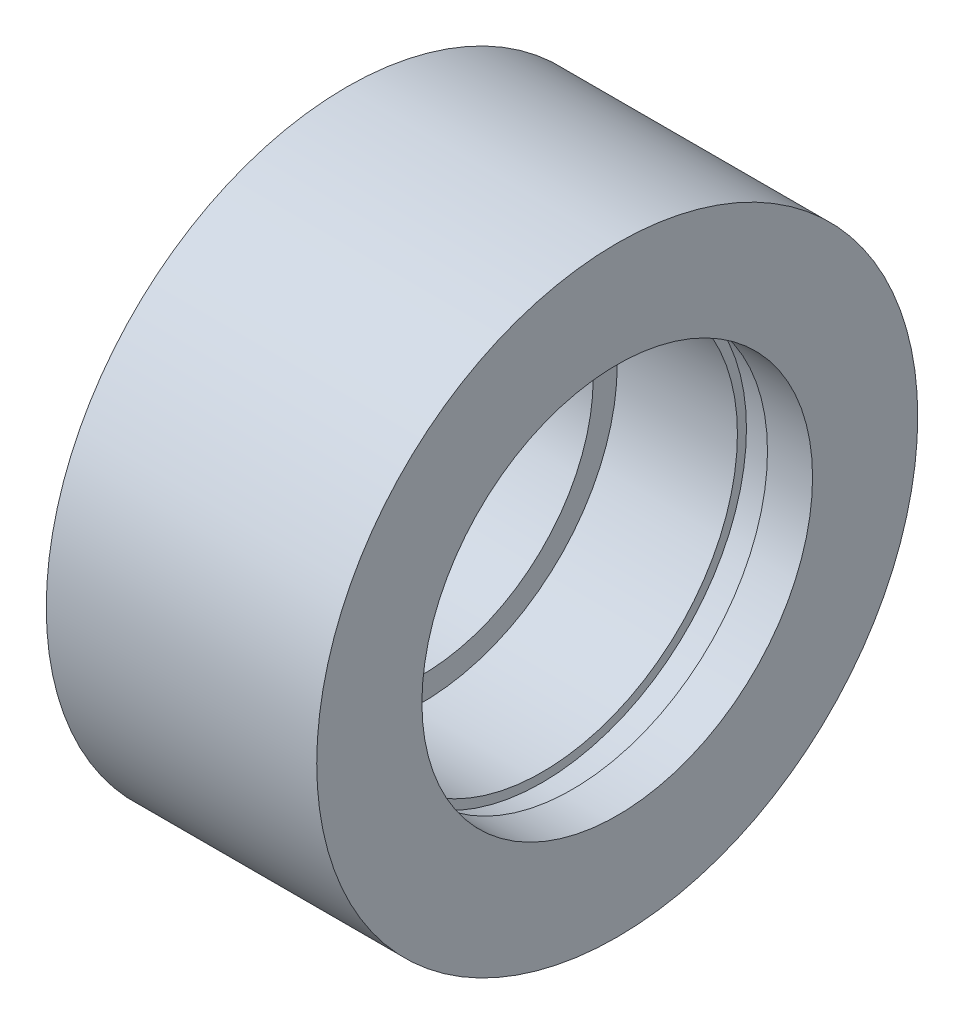
ISO-10303-21;
HEADER;
FILE_DESCRIPTION(('STEP AP214'),'2;1');
FILE_NAME('part.step','',(''),(''),'','','');
FILE_SCHEMA(('AUTOMOTIVE_DESIGN { 1 0 10303 214 1 1 1 1 }'));
ENDSEC;
DATA;
#1=APPLICATION_CONTEXT('core data for automotive mechanical design processes');
#2=APPLICATION_PROTOCOL_DEFINITION('international standard','automotive_design',2000,#1);
#3=PRODUCT_CONTEXT('',#1,'mechanical');
#4=PRODUCT('Part','Part','',(#3));
#5=PRODUCT_RELATED_PRODUCT_CATEGORY('part','',(#4));
#6=PRODUCT_DEFINITION_FORMATION('','',#4);
#7=PRODUCT_DEFINITION_CONTEXT('part definition',#1,'design');
#8=PRODUCT_DEFINITION('design','',#6,#7);
#9=PRODUCT_DEFINITION_SHAPE('','',#8);
#10=(LENGTH_UNIT() NAMED_UNIT(*) SI_UNIT(.MILLI.,.METRE.));
#11=(NAMED_UNIT(*) PLANE_ANGLE_UNIT() SI_UNIT($,.RADIAN.));
#12=(NAMED_UNIT(*) SI_UNIT($,.STERADIAN.) SOLID_ANGLE_UNIT());
#13=UNCERTAINTY_MEASURE_WITH_UNIT(LENGTH_MEASURE(1.E-05),#10,'distance_accuracy_value','');
#14=(GEOMETRIC_REPRESENTATION_CONTEXT(3) GLOBAL_UNCERTAINTY_ASSIGNED_CONTEXT((#13)) GLOBAL_UNIT_ASSIGNED_CONTEXT((#10,
#11,#12)) REPRESENTATION_CONTEXT('',''));
#15=CARTESIAN_POINT('',(0.,0.,0.));
#16=DIRECTION('',(0.,0.,1.));
#17=DIRECTION('',(1.,0.,0.));
#18=AXIS2_PLACEMENT_3D('',#15,#16,#17);
#19=CARTESIAN_POINT('',(-4.5,-10.2732395765881,10.));
#20=DIRECTION('',(-1.,0.,0.));
#21=DIRECTION('',(0.,1.,0.));
#22=AXIS2_PLACEMENT_3D('',#19,#20,#21);
#23=PLANE('',#22);
#24=CARTESIAN_POINT('',(-4.5,0.,0.));
#25=DIRECTION('',(-1.,0.,0.));
#26=DIRECTION('',(0.,0.,-1.));
#27=AXIS2_PLACEMENT_3D('',#24,#25,#26);
#28=CIRCLE('',#27,10.);
#29=CARTESIAN_POINT('',(-4.5,0.,-10.));
#30=VERTEX_POINT('',#29);
#31=EDGE_CURVE('E49',#30,#30,#28,.F.);
#32=ORIENTED_EDGE('',*,*,#31,.F.);
#33=EDGE_LOOP('',(#32));
#34=FACE_BOUND('',#33,.T.);
#35=CARTESIAN_POINT('',(-4.5,0.,0.));
#36=DIRECTION('',(1.,0.,0.));
#37=DIRECTION('',(0.,0.,1.));
#38=AXIS2_PLACEMENT_3D('',#35,#36,#37);
#39=CIRCLE('',#38,5.7);
#40=CARTESIAN_POINT('',(-4.5,0.,5.7));
#41=VERTEX_POINT('',#40);
#42=EDGE_CURVE('E46',#41,#41,#39,.T.);
#43=ORIENTED_EDGE('',*,*,#42,.T.);
#44=EDGE_LOOP('',(#43));
#45=FACE_BOUND('',#44,.T.);
#46=ADVANCED_FACE('F14',(#34,#45),#23,.T.);
#47=CARTESIAN_POINT('',(4.5,-10.2732395765881,-10.));
#48=DIRECTION('',(1.,0.,0.));
#49=DIRECTION('',(0.,1.,0.));
#50=AXIS2_PLACEMENT_3D('',#47,#48,#49);
#51=PLANE('',#50);
#52=CARTESIAN_POINT('',(4.5,0.,0.));
#53=DIRECTION('',(1.,0.,0.));
#54=DIRECTION('',(0.,0.,1.));
#55=AXIS2_PLACEMENT_3D('',#52,#53,#54);
#56=CIRCLE('',#55,10.);
#57=CARTESIAN_POINT('',(4.5,0.,10.));
#58=VERTEX_POINT('',#57);
#59=EDGE_CURVE('E43',#58,#58,#56,.T.);
#60=ORIENTED_EDGE('',*,*,#59,.T.);
#61=EDGE_LOOP('',(#60));
#62=FACE_BOUND('',#61,.T.);
#63=CARTESIAN_POINT('',(4.5,0.,0.));
#64=DIRECTION('',(-1.,0.,0.));
#65=DIRECTION('',(0.,0.,-1.));
#66=AXIS2_PLACEMENT_3D('',#63,#64,#65);
#67=CIRCLE('',#66,6.5);
#68=CARTESIAN_POINT('',(4.5,0.,-6.5));
#69=VERTEX_POINT('',#68);
#70=EDGE_CURVE('E40',#69,#69,#67,.F.);
#71=ORIENTED_EDGE('',*,*,#70,.F.);
#72=EDGE_LOOP('',(#71));
#73=FACE_BOUND('',#72,.T.);
#74=ADVANCED_FACE('F57',(#62,#73),#51,.T.);
#75=CARTESIAN_POINT('',(-2.,-6.67760572478215,6.4999999999999));
#76=DIRECTION('',(1.,0.,0.));
#77=DIRECTION('',(0.,0.,-1.));
#78=AXIS2_PLACEMENT_3D('',#75,#76,#77);
#79=PLANE('',#78);
#80=CARTESIAN_POINT('',(-2.,0.,0.));
#81=DIRECTION('',(1.,0.,0.));
#82=DIRECTION('',(0.,0.,1.));
#83=AXIS2_PLACEMENT_3D('',#80,#81,#82);
#84=CIRCLE('',#83,6.4999999999999);
#85=CARTESIAN_POINT('',(-2.,0.,6.4999999999999));
#86=VERTEX_POINT('',#85);
#87=EDGE_CURVE('E37',#86,#86,#84,.T.);
#88=ORIENTED_EDGE('',*,*,#87,.T.);
#89=EDGE_LOOP('',(#88));
#90=FACE_BOUND('',#89,.T.);
#91=CARTESIAN_POINT('',(-2.,0.,0.));
#92=DIRECTION('',(-1.,0.,0.));
#93=DIRECTION('',(0.,0.,-1.));
#94=AXIS2_PLACEMENT_3D('',#91,#92,#93);
#95=CIRCLE('',#94,5.7);
#96=CARTESIAN_POINT('',(-2.,0.,-5.7));
#97=VERTEX_POINT('',#96);
#98=EDGE_CURVE('E34',#97,#97,#95,.F.);
#99=ORIENTED_EDGE('',*,*,#98,.F.);
#100=EDGE_LOOP('',(#99));
#101=FACE_BOUND('',#100,.T.);
#102=ADVANCED_FACE('F89',(#90,#101),#79,.T.);
#103=CARTESIAN_POINT('',(2.,-6.9858029120799,6.8));
#104=DIRECTION('',(1.,0.,0.));
#105=DIRECTION('',(0.,0.,-1.));
#106=AXIS2_PLACEMENT_3D('',#103,#104,#105);
#107=PLANE('',#106);
#108=CARTESIAN_POINT('',(2.,0.,0.));
#109=DIRECTION('',(1.,0.,0.));
#110=DIRECTION('',(0.,0.,1.));
#111=AXIS2_PLACEMENT_3D('',#108,#109,#110);
#112=CIRCLE('',#111,6.8);
#113=CARTESIAN_POINT('',(2.,0.,6.8));
#114=VERTEX_POINT('',#113);
#115=EDGE_CURVE('E29',#114,#114,#112,.T.);
#116=ORIENTED_EDGE('',*,*,#115,.T.);
#117=EDGE_LOOP('',(#116));
#118=FACE_BOUND('',#117,.T.);
#119=CARTESIAN_POINT('',(2.,0.,0.));
#120=DIRECTION('',(-1.,0.,0.));
#121=DIRECTION('',(0.,0.,-1.));
#122=AXIS2_PLACEMENT_3D('',#119,#120,#121);
#123=CIRCLE('',#122,6.4999999999999);
#124=CARTESIAN_POINT('',(2.,0.,-6.4999999999999));
#125=VERTEX_POINT('',#124);
#126=EDGE_CURVE('E25',#125,#125,#123,.F.);
#127=ORIENTED_EDGE('',*,*,#126,.F.);
#128=EDGE_LOOP('',(#127));
#129=FACE_BOUND('',#128,.T.);
#130=ADVANCED_FACE('F86',(#118,#129),#107,.T.);
#131=CARTESIAN_POINT('',(3.,-6.9858029120799,-6.8));
#132=DIRECTION('',(-1.,0.,0.));
#133=DIRECTION('',(0.,0.,1.));
#134=AXIS2_PLACEMENT_3D('',#131,#132,#133);
#135=PLANE('',#134);
#136=CARTESIAN_POINT('',(3.,0.,0.));
#137=DIRECTION('',(-1.,0.,0.));
#138=DIRECTION('',(0.,0.,-1.));
#139=AXIS2_PLACEMENT_3D('',#136,#137,#138);
#140=CIRCLE('',#139,6.8);
#141=CARTESIAN_POINT('',(3.,0.,-6.8));
#142=VERTEX_POINT('',#141);
#143=EDGE_CURVE('E21',#142,#142,#140,.F.);
#144=ORIENTED_EDGE('',*,*,#143,.F.);
#145=EDGE_LOOP('',(#144));
#146=FACE_BOUND('',#145,.T.);
#147=CARTESIAN_POINT('',(3.,0.,0.));
#148=DIRECTION('',(1.,0.,0.));
#149=DIRECTION('',(0.,0.,1.));
#150=AXIS2_PLACEMENT_3D('',#147,#148,#149);
#151=CIRCLE('',#150,6.5);
#152=CARTESIAN_POINT('',(3.,0.,6.5));
#153=VERTEX_POINT('',#152);
#154=EDGE_CURVE('E10',#153,#153,#151,.T.);
#155=ORIENTED_EDGE('',*,*,#154,.T.);
#156=EDGE_LOOP('',(#155));
#157=FACE_BOUND('',#156,.T.);
#158=ADVANCED_FACE('F74',(#146,#157),#135,.T.);
#159=CARTESIAN_POINT('',(4.5,0.,0.));
#160=DIRECTION('',(1.,0.,0.));
#161=DIRECTION('',(0.,0.,1.));
#162=AXIS2_PLACEMENT_3D('',#159,#160,#161);
#163=CYLINDRICAL_SURFACE('',#162,10.);
#164=ORIENTED_EDGE('',*,*,#59,.F.);
#165=EDGE_LOOP('',(#164));
#166=FACE_BOUND('',#165,.T.);
#167=ORIENTED_EDGE('',*,*,#31,.T.);
#168=EDGE_LOOP('',(#167));
#169=FACE_BOUND('',#168,.T.);
#170=ADVANCED_FACE('F53',(#166,#169),#163,.T.);
#171=CARTESIAN_POINT('',(4.5,0.,0.));
#172=DIRECTION('',(1.,0.,0.));
#173=DIRECTION('',(0.,0.,1.));
#174=AXIS2_PLACEMENT_3D('',#171,#172,#173);
#175=CYLINDRICAL_SURFACE('',#174,5.7);
#176=ORIENTED_EDGE('',*,*,#98,.T.);
#177=EDGE_LOOP('',(#176));
#178=FACE_BOUND('',#177,.T.);
#179=ORIENTED_EDGE('',*,*,#42,.F.);
#180=EDGE_LOOP('',(#179));
#181=FACE_BOUND('',#180,.T.);
#182=ADVANCED_FACE('F61',(#178,#181),#175,.F.);
#183=CARTESIAN_POINT('',(4.5,0.,0.));
#184=DIRECTION('',(1.,0.,0.));
#185=DIRECTION('',(0.,0.,1.));
#186=AXIS2_PLACEMENT_3D('',#183,#184,#185);
#187=CYLINDRICAL_SURFACE('',#186,6.4999999999999);
#188=ORIENTED_EDGE('',*,*,#126,.T.);
#189=EDGE_LOOP('',(#188));
#190=FACE_BOUND('',#189,.T.);
#191=ORIENTED_EDGE('',*,*,#87,.F.);
#192=EDGE_LOOP('',(#191));
#193=FACE_BOUND('',#192,.T.);
#194=ADVANCED_FACE('F63',(#190,#193),#187,.F.);
#195=CARTESIAN_POINT('',(4.5,0.,0.));
#196=DIRECTION('',(1.,0.,0.));
#197=DIRECTION('',(0.,0.,1.));
#198=AXIS2_PLACEMENT_3D('',#195,#196,#197);
#199=CYLINDRICAL_SURFACE('',#198,6.8);
#200=ORIENTED_EDGE('',*,*,#143,.T.);
#201=EDGE_LOOP('',(#200));
#202=FACE_BOUND('',#201,.T.);
#203=ORIENTED_EDGE('',*,*,#115,.F.);
#204=EDGE_LOOP('',(#203));
#205=FACE_BOUND('',#204,.T.);
#206=ADVANCED_FACE('F71',(#202,#205),#199,.F.);
#207=CARTESIAN_POINT('',(4.5,0.,0.));
#208=DIRECTION('',(1.,0.,0.));
#209=DIRECTION('',(0.,0.,1.));
#210=AXIS2_PLACEMENT_3D('',#207,#208,#209);
#211=CYLINDRICAL_SURFACE('',#210,6.5);
#212=ORIENTED_EDGE('',*,*,#70,.T.);
#213=EDGE_LOOP('',(#212));
#214=FACE_BOUND('',#213,.T.);
#215=ORIENTED_EDGE('',*,*,#154,.F.);
#216=EDGE_LOOP('',(#215));
#217=FACE_BOUND('',#216,.T.);
#218=ADVANCED_FACE('F16',(#214,#217),#211,.F.);
#219=CLOSED_SHELL('',(#46,#74,#102,#130,#158,#170,#182,#194,#206,#218));
#220=MANIFOLD_SOLID_BREP('B1',#219);
#221=ADVANCED_BREP_SHAPE_REPRESENTATION('',(#18,#220),#14);
#222=SHAPE_DEFINITION_REPRESENTATION(#9,#221);
ENDSEC;
END-ISO-10303-21;
